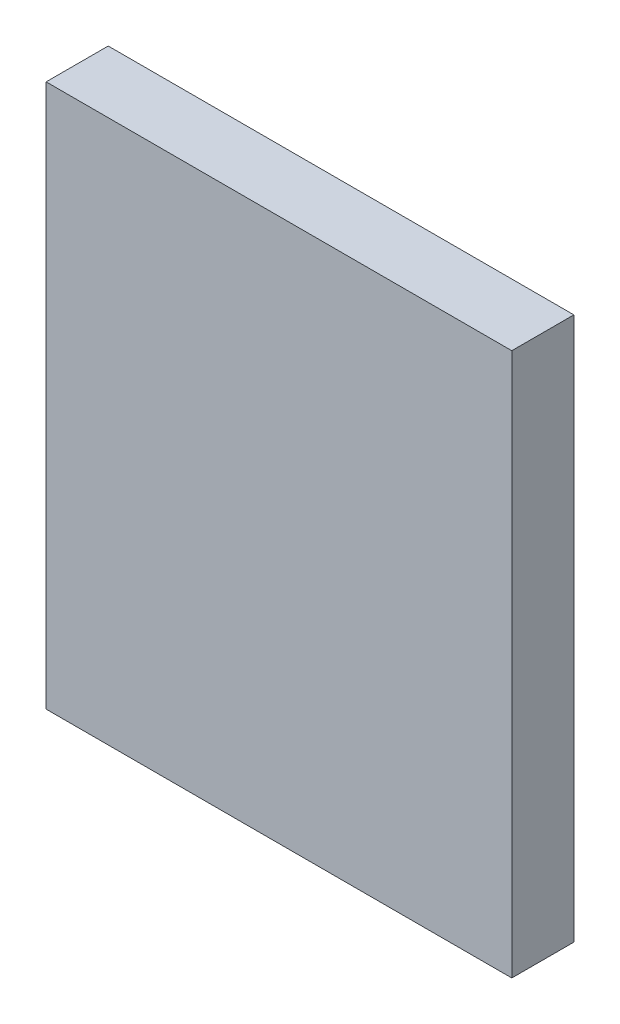
ISO-10303-21;
HEADER;
FILE_DESCRIPTION(('STEP AP214'),'2;1');
FILE_NAME('part.step','',(''),(''),'','','');
FILE_SCHEMA(('AUTOMOTIVE_DESIGN { 1 0 10303 214 1 1 1 1 }'));
ENDSEC;
DATA;
#1=APPLICATION_CONTEXT('core data for automotive mechanical design processes');
#2=APPLICATION_PROTOCOL_DEFINITION('international standard','automotive_design',2000,#1);
#3=PRODUCT_CONTEXT('',#1,'mechanical');
#4=PRODUCT('Part','Part','',(#3));
#5=PRODUCT_RELATED_PRODUCT_CATEGORY('part','',(#4));
#6=PRODUCT_DEFINITION_FORMATION('','',#4);
#7=PRODUCT_DEFINITION_CONTEXT('part definition',#1,'design');
#8=PRODUCT_DEFINITION('design','',#6,#7);
#9=PRODUCT_DEFINITION_SHAPE('','',#8);
#10=(LENGTH_UNIT() NAMED_UNIT(*) SI_UNIT(.MILLI.,.METRE.));
#11=(NAMED_UNIT(*) PLANE_ANGLE_UNIT() SI_UNIT($,.RADIAN.));
#12=(NAMED_UNIT(*) SI_UNIT($,.STERADIAN.) SOLID_ANGLE_UNIT());
#13=UNCERTAINTY_MEASURE_WITH_UNIT(LENGTH_MEASURE(1.E-05),#10,'distance_accuracy_value','');
#14=(GEOMETRIC_REPRESENTATION_CONTEXT(3) GLOBAL_UNCERTAINTY_ASSIGNED_CONTEXT((#13)) GLOBAL_UNIT_ASSIGNED_CONTEXT((#10,
#11,#12)) REPRESENTATION_CONTEXT('',''));
#15=CARTESIAN_POINT('',(0.,0.,0.));
#16=DIRECTION('',(0.,0.,1.));
#17=DIRECTION('',(1.,0.,0.));
#18=AXIS2_PLACEMENT_3D('',#15,#16,#17);
#19=CARTESIAN_POINT('',(-15.,-17.5,4.));
#20=DIRECTION('',(1.,0.,0.));
#21=DIRECTION('',(0.,0.,-1.));
#22=AXIS2_PLACEMENT_3D('',#19,#20,#21);
#23=PLANE('',#22);
#24=DIRECTION('',(0.,-1.,0.));
#25=VECTOR('',#24,1.);
#26=CARTESIAN_POINT('',(-15.,-17.5,0.));
#27=LINE('',#26,#25);
#28=CARTESIAN_POINT('',(-15.,17.5,0.));
#29=VERTEX_POINT('',#28);
#30=CARTESIAN_POINT('',(-15.,-17.5,0.));
#31=VERTEX_POINT('',#30);
#32=EDGE_CURVE('E104',#29,#31,#27,.T.);
#33=ORIENTED_EDGE('',*,*,#32,.T.);
#34=DIRECTION('',(0.,0.,-1.));
#35=VECTOR('',#34,1.);
#36=CARTESIAN_POINT('',(-15.,-17.5,4.));
#37=LINE('',#36,#35);
#38=CARTESIAN_POINT('',(-15.,-17.5,4.));
#39=VERTEX_POINT('',#38);
#40=EDGE_CURVE('E11',#39,#31,#37,.T.);
#41=ORIENTED_EDGE('',*,*,#40,.F.);
#42=DIRECTION('',(0.,-1.,0.));
#43=VECTOR('',#42,1.);
#44=CARTESIAN_POINT('',(-15.,-17.5,4.));
#45=LINE('',#44,#43);
#46=CARTESIAN_POINT('',(-15.,17.5,4.));
#47=VERTEX_POINT('',#46);
#48=EDGE_CURVE('E92',#47,#39,#45,.T.);
#49=ORIENTED_EDGE('',*,*,#48,.F.);
#50=DIRECTION('',(0.,0.,-1.));
#51=VECTOR('',#50,1.);
#52=CARTESIAN_POINT('',(-15.,17.5,4.));
#53=LINE('',#52,#51);
#54=EDGE_CURVE('E100',#47,#29,#53,.T.);
#55=ORIENTED_EDGE('',*,*,#54,.T.);
#56=EDGE_LOOP('',(#33,#41,#49,#55));
#57=FACE_BOUND('',#56,.T.);
#58=ADVANCED_FACE('F41',(#57),#23,.F.);
#59=CARTESIAN_POINT('',(15.,-17.5,4.));
#60=DIRECTION('',(0.,1.,0.));
#61=DIRECTION('',(0.,0.,1.));
#62=AXIS2_PLACEMENT_3D('',#59,#60,#61);
#63=PLANE('',#62);
#64=DIRECTION('',(1.,0.,0.));
#65=VECTOR('',#64,1.);
#66=CARTESIAN_POINT('',(15.,-17.5,0.));
#67=LINE('',#66,#65);
#68=CARTESIAN_POINT('',(15.,-17.5,0.));
#69=VERTEX_POINT('',#68);
#70=EDGE_CURVE('E96',#31,#69,#67,.T.);
#71=ORIENTED_EDGE('',*,*,#70,.T.);
#72=DIRECTION('',(0.,0.,-1.));
#73=VECTOR('',#72,1.);
#74=CARTESIAN_POINT('',(15.,-17.5,4.));
#75=LINE('',#74,#73);
#76=CARTESIAN_POINT('',(15.,-17.5,4.));
#77=VERTEX_POINT('',#76);
#78=EDGE_CURVE('E49',#77,#69,#75,.T.);
#79=ORIENTED_EDGE('',*,*,#78,.F.);
#80=DIRECTION('',(1.,0.,0.));
#81=VECTOR('',#80,1.);
#82=CARTESIAN_POINT('',(15.,-17.5,4.));
#83=LINE('',#82,#81);
#84=EDGE_CURVE('E87',#39,#77,#83,.T.);
#85=ORIENTED_EDGE('',*,*,#84,.F.);
#86=ORIENTED_EDGE('',*,*,#40,.T.);
#87=EDGE_LOOP('',(#71,#79,#85,#86));
#88=FACE_BOUND('',#87,.T.);
#89=ADVANCED_FACE('F95',(#88),#63,.F.);
#90=CARTESIAN_POINT('',(15.,-17.5,4.));
#91=DIRECTION('',(-1.,0.,0.));
#92=DIRECTION('',(0.,0.,1.));
#93=AXIS2_PLACEMENT_3D('',#90,#91,#92);
#94=PLANE('',#93);
#95=DIRECTION('',(0.,1.,0.));
#96=VECTOR('',#95,1.);
#97=CARTESIAN_POINT('',(15.,-17.5,0.));
#98=LINE('',#97,#96);
#99=CARTESIAN_POINT('',(15.,17.5,0.));
#100=VERTEX_POINT('',#99);
#101=EDGE_CURVE('E74',#69,#100,#98,.T.);
#102=ORIENTED_EDGE('',*,*,#101,.T.);
#103=DIRECTION('',(0.,0.,-1.));
#104=VECTOR('',#103,1.);
#105=CARTESIAN_POINT('',(15.,17.5,4.));
#106=LINE('',#105,#104);
#107=CARTESIAN_POINT('',(15.,17.5,4.));
#108=VERTEX_POINT('',#107);
#109=EDGE_CURVE('E97',#108,#100,#106,.T.);
#110=ORIENTED_EDGE('',*,*,#109,.F.);
#111=DIRECTION('',(0.,1.,0.));
#112=VECTOR('',#111,1.);
#113=CARTESIAN_POINT('',(15.,-17.5,4.));
#114=LINE('',#113,#112);
#115=EDGE_CURVE('E90',#77,#108,#114,.T.);
#116=ORIENTED_EDGE('',*,*,#115,.F.);
#117=ORIENTED_EDGE('',*,*,#78,.T.);
#118=EDGE_LOOP('',(#102,#110,#116,#117));
#119=FACE_BOUND('',#118,.T.);
#120=ADVANCED_FACE('F98',(#119),#94,.F.);
#121=CARTESIAN_POINT('',(15.,17.5,4.));
#122=DIRECTION('',(0.,-1.,0.));
#123=DIRECTION('',(0.,0.,-1.));
#124=AXIS2_PLACEMENT_3D('',#121,#122,#123);
#125=PLANE('',#124);
#126=DIRECTION('',(-1.,0.,0.));
#127=VECTOR('',#126,1.);
#128=CARTESIAN_POINT('',(15.,17.5,0.));
#129=LINE('',#128,#127);
#130=EDGE_CURVE('E80',#100,#29,#129,.T.);
#131=ORIENTED_EDGE('',*,*,#130,.T.);
#132=ORIENTED_EDGE('',*,*,#54,.F.);
#133=DIRECTION('',(-1.,0.,0.));
#134=VECTOR('',#133,1.);
#135=CARTESIAN_POINT('',(15.,17.5,4.));
#136=LINE('',#135,#134);
#137=EDGE_CURVE('E57',#108,#47,#136,.T.);
#138=ORIENTED_EDGE('',*,*,#137,.F.);
#139=ORIENTED_EDGE('',*,*,#109,.T.);
#140=EDGE_LOOP('',(#131,#132,#138,#139));
#141=FACE_BOUND('',#140,.T.);
#142=ADVANCED_FACE('F111',(#141),#125,.F.);
#143=CARTESIAN_POINT('',(0.,0.,4.));
#144=DIRECTION('',(0.,0.,1.));
#145=DIRECTION('',(1.,0.,0.));
#146=AXIS2_PLACEMENT_3D('',#143,#144,#145);
#147=PLANE('',#146);
#148=ORIENTED_EDGE('',*,*,#48,.T.);
#149=ORIENTED_EDGE('',*,*,#84,.T.);
#150=ORIENTED_EDGE('',*,*,#115,.T.);
#151=ORIENTED_EDGE('',*,*,#137,.T.);
#152=EDGE_LOOP('',(#148,#149,#150,#151));
#153=FACE_BOUND('',#152,.T.);
#154=ADVANCED_FACE('F88',(#153),#147,.T.);
#155=CARTESIAN_POINT('',(0.,0.,0.));
#156=DIRECTION('',(0.,0.,1.));
#157=DIRECTION('',(1.,0.,0.));
#158=AXIS2_PLACEMENT_3D('',#155,#156,#157);
#159=PLANE('',#158);
#160=ORIENTED_EDGE('',*,*,#32,.F.);
#161=ORIENTED_EDGE('',*,*,#130,.F.);
#162=ORIENTED_EDGE('',*,*,#101,.F.);
#163=ORIENTED_EDGE('',*,*,#70,.F.);
#164=EDGE_LOOP('',(#160,#161,#162,#163));
#165=FACE_BOUND('',#164,.T.);
#166=ADVANCED_FACE('F114',(#165),#159,.F.);
#167=CLOSED_SHELL('',(#58,#89,#120,#142,#154,#166));
#168=MANIFOLD_SOLID_BREP('B2',#167);
#169=ADVANCED_BREP_SHAPE_REPRESENTATION('',(#18,#168),#14);
#170=SHAPE_DEFINITION_REPRESENTATION(#9,#169);
ENDSEC;
END-ISO-10303-21;
